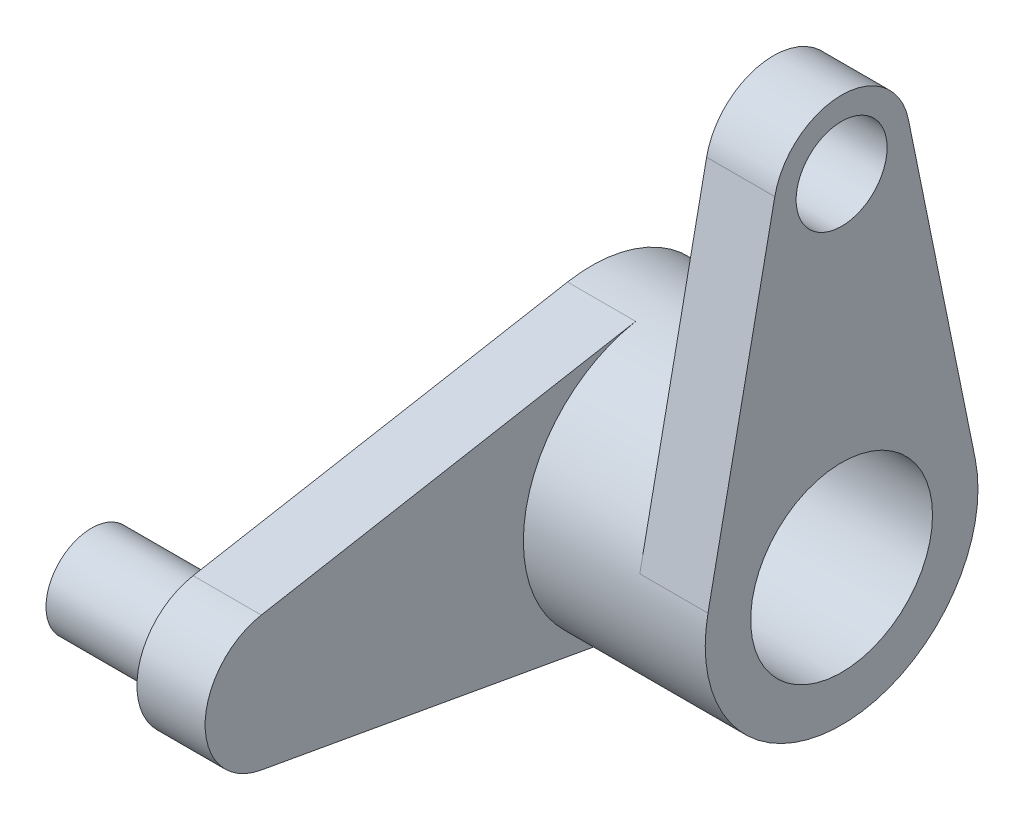
ISO-10303-21;
HEADER;
FILE_DESCRIPTION(('STEP AP214'),'2;1');
FILE_NAME('part.step','',(''),(''),'','','');
FILE_SCHEMA(('AUTOMOTIVE_DESIGN { 1 0 10303 214 1 1 1 1 }'));
ENDSEC;
DATA;
#1=APPLICATION_CONTEXT('core data for automotive mechanical design processes');
#2=APPLICATION_PROTOCOL_DEFINITION('international standard','automotive_design',2000,#1);
#3=PRODUCT_CONTEXT('',#1,'mechanical');
#4=PRODUCT('Part','Part','',(#3));
#5=PRODUCT_RELATED_PRODUCT_CATEGORY('part','',(#4));
#6=PRODUCT_DEFINITION_FORMATION('','',#4);
#7=PRODUCT_DEFINITION_CONTEXT('part definition',#1,'design');
#8=PRODUCT_DEFINITION('design','',#6,#7);
#9=PRODUCT_DEFINITION_SHAPE('','',#8);
#10=(LENGTH_UNIT() NAMED_UNIT(*) SI_UNIT(.MILLI.,.METRE.));
#11=(NAMED_UNIT(*) PLANE_ANGLE_UNIT() SI_UNIT($,.RADIAN.));
#12=(NAMED_UNIT(*) SI_UNIT($,.STERADIAN.) SOLID_ANGLE_UNIT());
#13=UNCERTAINTY_MEASURE_WITH_UNIT(LENGTH_MEASURE(1.E-05),#10,'distance_accuracy_value','');
#14=(GEOMETRIC_REPRESENTATION_CONTEXT(3) GLOBAL_UNCERTAINTY_ASSIGNED_CONTEXT((#13)) GLOBAL_UNIT_ASSIGNED_CONTEXT((#10,
#11,#12)) REPRESENTATION_CONTEXT('',''));
#15=CARTESIAN_POINT('',(0.,0.,0.));
#16=DIRECTION('',(0.,0.,1.));
#17=DIRECTION('',(1.,0.,0.));
#18=AXIS2_PLACEMENT_3D('',#15,#16,#17);
#19=CARTESIAN_POINT('',(15.,0.,85.));
#20=DIRECTION('',(-1.,0.,0.));
#21=DIRECTION('',(0.,0.,1.));
#22=AXIS2_PLACEMENT_3D('',#19,#20,#21);
#23=CYLINDRICAL_SURFACE('',#22,15.);
#24=CARTESIAN_POINT('',(0.,0.,85.));
#25=DIRECTION('',(1.,0.,0.));
#26=DIRECTION('',(0.,0.,-1.));
#27=AXIS2_PLACEMENT_3D('',#24,#25,#26);
#28=CIRCLE('',#27,15.);
#29=CARTESIAN_POINT('',(0.,14.7645887035425,87.6470588235293));
#30=VERTEX_POINT('',#29);
#31=CARTESIAN_POINT('',(0.,-14.7645887035425,87.6470588235294));
#32=VERTEX_POINT('',#31);
#33=EDGE_CURVE('E145',#30,#32,#28,.T.);
#34=ORIENTED_EDGE('',*,*,#33,.T.);
#35=DIRECTION('',(-1.,0.,0.));
#36=VECTOR('',#35,1.);
#37=CARTESIAN_POINT('',(15.,-14.7645887035425,87.6470588235294));
#38=LINE('',#37,#36);
#39=CARTESIAN_POINT('',(15.,-14.7645887035425,87.6470588235294));
#40=VERTEX_POINT('',#39);
#41=EDGE_CURVE('E46',#40,#32,#38,.T.);
#42=ORIENTED_EDGE('',*,*,#41,.F.);
#43=CARTESIAN_POINT('',(15.,0.,85.));
#44=DIRECTION('',(1.,0.,0.));
#45=DIRECTION('',(0.,0.,-1.));
#46=AXIS2_PLACEMENT_3D('',#43,#44,#45);
#47=CIRCLE('',#46,15.);
#48=CARTESIAN_POINT('',(15.,14.7645887035425,87.6470588235293));
#49=VERTEX_POINT('',#48);
#50=EDGE_CURVE('E147',#49,#40,#47,.T.);
#51=ORIENTED_EDGE('',*,*,#50,.F.);
#52=DIRECTION('',(-1.,0.,0.));
#53=VECTOR('',#52,1.);
#54=CARTESIAN_POINT('',(15.,14.7645887035425,87.6470588235293));
#55=LINE('',#54,#53);
#56=EDGE_CURVE('E151',#49,#30,#55,.T.);
#57=ORIENTED_EDGE('',*,*,#56,.T.);
#58=EDGE_LOOP('',(#34,#42,#51,#57));
#59=FACE_BOUND('',#58,.T.);
#60=ADVANCED_FACE('F39',(#59),#23,.T.);
#61=CARTESIAN_POINT('',(15.,-14.7645887035425,87.6470588235294));
#62=DIRECTION('',(0.,0.984305913569501,-0.176470588235294));
#63=DIRECTION('',(0.,0.176470588235294,0.984305913569501));
#64=AXIS2_PLACEMENT_3D('',#61,#62,#63);
#65=PLANE('',#64);
#66=DIRECTION('',(0.,-0.176470588235294,-0.984305913569501));
#67=VECTOR('',#66,1.);
#68=CARTESIAN_POINT('',(0.,-14.7645887035425,87.6470588235294));
#69=LINE('',#68,#67);
#70=CARTESIAN_POINT('',(0.,-29.529177407085,5.29411764705882));
#71=VERTEX_POINT('',#70);
#72=EDGE_CURVE('E154',#32,#71,#69,.T.);
#73=ORIENTED_EDGE('',*,*,#72,.T.);
#74=DIRECTION('',(-1.,0.,0.));
#75=VECTOR('',#74,1.);
#76=CARTESIAN_POINT('',(15.,-29.529177407085,5.29411764705882));
#77=LINE('',#76,#75);
#78=CARTESIAN_POINT('',(15.,-29.529177407085,5.29411764705882));
#79=VERTEX_POINT('',#78);
#80=EDGE_CURVE('E162',#79,#71,#77,.T.);
#81=ORIENTED_EDGE('',*,*,#80,.F.);
#82=DIRECTION('',(0.,-0.176470588235294,-0.984305913569501));
#83=VECTOR('',#82,1.);
#84=CARTESIAN_POINT('',(15.,-14.7645887035425,87.6470588235294));
#85=LINE('',#84,#83);
#86=EDGE_CURVE('E89',#40,#79,#85,.T.);
#87=ORIENTED_EDGE('',*,*,#86,.F.);
#88=ORIENTED_EDGE('',*,*,#41,.T.);
#89=EDGE_LOOP('',(#73,#81,#87,#88));
#90=FACE_BOUND('',#89,.T.);
#91=ADVANCED_FACE('F165',(#90),#65,.F.);
#92=CARTESIAN_POINT('',(15.,0.,0.));
#93=DIRECTION('',(-1.,0.,0.));
#94=DIRECTION('',(0.,0.,1.));
#95=AXIS2_PLACEMENT_3D('',#92,#93,#94);
#96=CYLINDRICAL_SURFACE('',#95,30.);
#97=CARTESIAN_POINT('',(0.,0.,0.));
#98=DIRECTION('',(1.,0.,0.));
#99=DIRECTION('',(0.,0.,-1.));
#100=AXIS2_PLACEMENT_3D('',#97,#98,#99);
#101=CIRCLE('',#100,30.);
#102=CARTESIAN_POINT('',(0.,29.529177407085,5.29411764705884));
#103=VERTEX_POINT('',#102);
#104=EDGE_CURVE('E156',#71,#103,#101,.T.);
#105=ORIENTED_EDGE('',*,*,#104,.T.);
#106=DIRECTION('',(-1.,0.,0.));
#107=VECTOR('',#106,1.);
#108=CARTESIAN_POINT('',(15.,29.529177407085,5.29411764705884));
#109=LINE('',#108,#107);
#110=CARTESIAN_POINT('',(15.,29.529177407085,5.29411764705884));
#111=VERTEX_POINT('',#110);
#112=EDGE_CURVE('E160',#111,#103,#109,.T.);
#113=ORIENTED_EDGE('',*,*,#112,.F.);
#114=CARTESIAN_POINT('',(15.,0.,0.));
#115=DIRECTION('',(1.,0.,0.));
#116=DIRECTION('',(0.,0.,-1.));
#117=AXIS2_PLACEMENT_3D('',#114,#115,#116);
#118=CIRCLE('',#117,30.);
#119=EDGE_CURVE('E137',#111,#79,#118,.T.);
#120=ORIENTED_EDGE('',*,*,#119,.T.);
#121=ORIENTED_EDGE('',*,*,#80,.T.);
#122=EDGE_LOOP('',(#105,#113,#120,#121));
#123=FACE_BOUND('',#122,.T.);
#124=CARTESIAN_POINT('',(40.,0.,0.));
#125=DIRECTION('',(1.,0.,0.));
#126=DIRECTION('',(0.,0.,-1.));
#127=AXIS2_PLACEMENT_3D('',#124,#125,#126);
#128=CIRCLE('',#127,30.);
#129=CARTESIAN_POINT('',(40.,5.99999999999999,-29.3938769133981));
#130=VERTEX_POINT('',#129);
#131=CARTESIAN_POINT('',(40.,5.99999999999999,29.3938769133981));
#132=VERTEX_POINT('',#131);
#133=EDGE_CURVE('E53',#130,#132,#128,.T.);
#134=ORIENTED_EDGE('',*,*,#133,.F.);
#135=DIRECTION('',(-1.,0.,0.));
#136=VECTOR('',#135,1.);
#137=CARTESIAN_POINT('',(55.,5.99999999999999,-29.3938769133981));
#138=LINE('',#137,#136);
#139=CARTESIAN_POINT('',(55.,5.99999999999999,-29.3938769133981));
#140=VERTEX_POINT('',#139);
#141=EDGE_CURVE('E118',#140,#130,#138,.T.);
#142=ORIENTED_EDGE('',*,*,#141,.F.);
#143=CARTESIAN_POINT('',(55.,0.,0.));
#144=DIRECTION('',(1.,0.,0.));
#145=DIRECTION('',(0.,0.,-1.));
#146=AXIS2_PLACEMENT_3D('',#143,#144,#145);
#147=CIRCLE('',#146,30.);
#148=CARTESIAN_POINT('',(55.,5.99999999999999,29.3938769133981));
#149=VERTEX_POINT('',#148);
#150=EDGE_CURVE('E124',#149,#140,#147,.T.);
#151=ORIENTED_EDGE('',*,*,#150,.F.);
#152=DIRECTION('',(-1.,0.,0.));
#153=VECTOR('',#152,1.);
#154=CARTESIAN_POINT('',(55.,5.99999999999999,29.3938769133981));
#155=LINE('',#154,#153);
#156=EDGE_CURVE('E339',#149,#132,#155,.T.);
#157=ORIENTED_EDGE('',*,*,#156,.T.);
#158=EDGE_LOOP('',(#134,#142,#151,#157));
#159=FACE_BOUND('',#158,.T.);
#160=ADVANCED_FACE('F136',(#123,#159),#96,.T.);
#161=CARTESIAN_POINT('',(15.,14.7645887035425,87.6470588235293));
#162=DIRECTION('',(0.,-0.9843059135695,-0.176470588235294));
#163=DIRECTION('',(0.,0.176470588235294,-0.984305913569501));
#164=AXIS2_PLACEMENT_3D('',#161,#162,#163);
#165=PLANE('',#164);
#166=DIRECTION('',(0.,-0.176470588235294,0.984305913569501));
#167=VECTOR('',#166,1.);
#168=CARTESIAN_POINT('',(0.,14.7645887035425,87.6470588235293));
#169=LINE('',#168,#167);
#170=EDGE_CURVE('E83',#103,#30,#169,.T.);
#171=ORIENTED_EDGE('',*,*,#170,.T.);
#172=ORIENTED_EDGE('',*,*,#56,.F.);
#173=DIRECTION('',(0.,-0.176470588235294,0.984305913569501));
#174=VECTOR('',#173,1.);
#175=CARTESIAN_POINT('',(15.,14.7645887035425,87.6470588235293));
#176=LINE('',#175,#174);
#177=EDGE_CURVE('E62',#111,#49,#176,.T.);
#178=ORIENTED_EDGE('',*,*,#177,.F.);
#179=ORIENTED_EDGE('',*,*,#112,.T.);
#180=EDGE_LOOP('',(#171,#172,#178,#179));
#181=FACE_BOUND('',#180,.T.);
#182=ADVANCED_FACE('F174',(#181),#165,.F.);
#183=CARTESIAN_POINT('',(15.,0.,85.));
#184=DIRECTION('',(1.,0.,0.));
#185=DIRECTION('',(0.,0.,-1.));
#186=AXIS2_PLACEMENT_3D('',#183,#184,#185);
#187=PLANE('',#186);
#188=ORIENTED_EDGE('',*,*,#119,.F.);
#189=ORIENTED_EDGE('',*,*,#177,.T.);
#190=ORIENTED_EDGE('',*,*,#50,.T.);
#191=ORIENTED_EDGE('',*,*,#86,.T.);
#192=EDGE_LOOP('',(#188,#189,#190,#191));
#193=FACE_BOUND('',#192,.T.);
#194=ADVANCED_FACE('F175',(#193),#187,.T.);
#195=CARTESIAN_POINT('',(0.,0.,85.));
#196=DIRECTION('',(1.,0.,0.));
#197=DIRECTION('',(0.,0.,-1.));
#198=AXIS2_PLACEMENT_3D('',#195,#196,#197);
#199=PLANE('',#198);
#200=CARTESIAN_POINT('',(0.,0.,85.));
#201=DIRECTION('',(1.,0.,0.));
#202=DIRECTION('',(0.,0.,-1.));
#203=AXIS2_PLACEMENT_3D('',#200,#201,#202);
#204=CIRCLE('',#203,10.);
#205=CARTESIAN_POINT('',(0.,0.,75.));
#206=VERTEX_POINT('',#205);
#207=EDGE_CURVE('E11',#206,#206,#204,.F.);
#208=ORIENTED_EDGE('',*,*,#207,.F.);
#209=EDGE_LOOP('',(#208));
#210=FACE_BOUND('',#209,.T.);
#211=CARTESIAN_POINT('',(0.,0.,0.));
#212=DIRECTION('',(1.,0.,0.));
#213=DIRECTION('',(0.,0.,-1.));
#214=AXIS2_PLACEMENT_3D('',#211,#212,#213);
#215=CIRCLE('',#214,20.);
#216=CARTESIAN_POINT('',(0.,0.,-20.));
#217=VERTEX_POINT('',#216);
#218=EDGE_CURVE('E322',#217,#217,#215,.T.);
#219=ORIENTED_EDGE('',*,*,#218,.T.);
#220=EDGE_LOOP('',(#219));
#221=FACE_BOUND('',#220,.T.);
#222=ORIENTED_EDGE('',*,*,#33,.F.);
#223=ORIENTED_EDGE('',*,*,#170,.F.);
#224=ORIENTED_EDGE('',*,*,#104,.F.);
#225=ORIENTED_EDGE('',*,*,#72,.F.);
#226=EDGE_LOOP('',(#222,#223,#224,#225));
#227=FACE_BOUND('',#226,.T.);
#228=ADVANCED_FACE('F170',(#210,#221,#227),#199,.F.);
#229=CARTESIAN_POINT('',(40.,0.,0.));
#230=DIRECTION('',(1.,0.,0.));
#231=DIRECTION('',(0.,0.,-1.));
#232=AXIS2_PLACEMENT_3D('',#229,#230,#231);
#233=PLANE('',#232);
#234=CARTESIAN_POINT('',(40.,75.,0.));
#235=DIRECTION('',(1.,0.,0.));
#236=DIRECTION('',(0.,0.,-1.));
#237=AXIS2_PLACEMENT_3D('',#234,#235,#236);
#238=CIRCLE('',#237,9.99999999999999);
#239=CARTESIAN_POINT('',(40.,75.,-9.99999999999999));
#240=VERTEX_POINT('',#239);
#241=EDGE_CURVE('E325',#240,#240,#238,.T.);
#242=ORIENTED_EDGE('',*,*,#241,.T.);
#243=EDGE_LOOP('',(#242));
#244=FACE_BOUND('',#243,.T.);
#245=DIRECTION('',(0.,0.979795897113271,0.2));
#246=VECTOR('',#245,1.);
#247=CARTESIAN_POINT('',(40.,5.99999999999999,-29.3938769133981));
#248=LINE('',#247,#246);
#249=CARTESIAN_POINT('',(40.,78.,-14.6969384566991));
#250=VERTEX_POINT('',#249);
#251=EDGE_CURVE('E335',#130,#250,#248,.T.);
#252=ORIENTED_EDGE('',*,*,#251,.F.);
#253=ORIENTED_EDGE('',*,*,#133,.T.);
#254=DIRECTION('',(0.,-0.979795897113271,0.2));
#255=VECTOR('',#254,1.);
#256=CARTESIAN_POINT('',(40.,5.99999999999999,29.3938769133981));
#257=LINE('',#256,#255);
#258=CARTESIAN_POINT('',(40.,78.,14.6969384566991));
#259=VERTEX_POINT('',#258);
#260=EDGE_CURVE('E134',#259,#132,#257,.T.);
#261=ORIENTED_EDGE('',*,*,#260,.F.);
#262=CARTESIAN_POINT('',(40.,75.,0.));
#263=DIRECTION('',(1.,0.,0.));
#264=DIRECTION('',(0.,0.,-1.));
#265=AXIS2_PLACEMENT_3D('',#262,#263,#264);
#266=CIRCLE('',#265,15.);
#267=EDGE_CURVE('E341',#250,#259,#266,.T.);
#268=ORIENTED_EDGE('',*,*,#267,.F.);
#269=EDGE_LOOP('',(#252,#253,#261,#268));
#270=FACE_BOUND('',#269,.T.);
#271=ADVANCED_FACE('F183',(#244,#270),#233,.F.);
#272=CARTESIAN_POINT('',(55.,0.,0.));
#273=DIRECTION('',(1.,0.,0.));
#274=DIRECTION('',(0.,0.,-1.));
#275=AXIS2_PLACEMENT_3D('',#272,#273,#274);
#276=PLANE('',#275);
#277=CARTESIAN_POINT('',(55.,0.,0.));
#278=DIRECTION('',(1.,0.,0.));
#279=DIRECTION('',(0.,0.,-1.));
#280=AXIS2_PLACEMENT_3D('',#277,#278,#279);
#281=CIRCLE('',#280,20.);
#282=CARTESIAN_POINT('',(55.,0.,-20.));
#283=VERTEX_POINT('',#282);
#284=EDGE_CURVE('E331',#283,#283,#281,.T.);
#285=ORIENTED_EDGE('',*,*,#284,.F.);
#286=EDGE_LOOP('',(#285));
#287=FACE_BOUND('',#286,.T.);
#288=ORIENTED_EDGE('',*,*,#150,.T.);
#289=DIRECTION('',(0.,0.979795897113271,0.2));
#290=VECTOR('',#289,1.);
#291=CARTESIAN_POINT('',(55.,5.99999999999999,-29.3938769133981));
#292=LINE('',#291,#290);
#293=CARTESIAN_POINT('',(55.,78.,-14.6969384566991));
#294=VERTEX_POINT('',#293);
#295=EDGE_CURVE('E114',#140,#294,#292,.T.);
#296=ORIENTED_EDGE('',*,*,#295,.T.);
#297=CARTESIAN_POINT('',(55.,75.,0.));
#298=DIRECTION('',(1.,0.,0.));
#299=DIRECTION('',(0.,0.,-1.));
#300=AXIS2_PLACEMENT_3D('',#297,#298,#299);
#301=CIRCLE('',#300,15.);
#302=CARTESIAN_POINT('',(55.,78.,14.6969384566991));
#303=VERTEX_POINT('',#302);
#304=EDGE_CURVE('E123',#294,#303,#301,.T.);
#305=ORIENTED_EDGE('',*,*,#304,.T.);
#306=DIRECTION('',(0.,-0.979795897113271,0.2));
#307=VECTOR('',#306,1.);
#308=CARTESIAN_POINT('',(55.,5.99999999999999,29.3938769133981));
#309=LINE('',#308,#307);
#310=EDGE_CURVE('E130',#303,#149,#309,.T.);
#311=ORIENTED_EDGE('',*,*,#310,.T.);
#312=EDGE_LOOP('',(#288,#296,#305,#311));
#313=FACE_BOUND('',#312,.T.);
#314=CARTESIAN_POINT('',(55.,75.,0.));
#315=DIRECTION('',(1.,0.,0.));
#316=DIRECTION('',(0.,0.,-1.));
#317=AXIS2_PLACEMENT_3D('',#314,#315,#316);
#318=CIRCLE('',#317,9.99999999999999);
#319=CARTESIAN_POINT('',(55.,75.,-9.99999999999999));
#320=VERTEX_POINT('',#319);
#321=EDGE_CURVE('E328',#320,#320,#318,.T.);
#322=ORIENTED_EDGE('',*,*,#321,.F.);
#323=EDGE_LOOP('',(#322));
#324=FACE_BOUND('',#323,.T.);
#325=ADVANCED_FACE('F127',(#287,#313,#324),#276,.T.);
#326=CARTESIAN_POINT('',(55.,5.99999999999999,-29.3938769133981));
#327=DIRECTION('',(0.,-0.2,0.979795897113271));
#328=DIRECTION('',(0.,-0.979795897113271,-0.2));
#329=AXIS2_PLACEMENT_3D('',#326,#327,#328);
#330=PLANE('',#329);
#331=ORIENTED_EDGE('',*,*,#251,.T.);
#332=DIRECTION('',(-1.,0.,0.));
#333=VECTOR('',#332,1.);
#334=CARTESIAN_POINT('',(55.,78.,-14.6969384566991));
#335=LINE('',#334,#333);
#336=EDGE_CURVE('E120',#294,#250,#335,.T.);
#337=ORIENTED_EDGE('',*,*,#336,.F.);
#338=ORIENTED_EDGE('',*,*,#295,.F.);
#339=ORIENTED_EDGE('',*,*,#141,.T.);
#340=EDGE_LOOP('',(#331,#337,#338,#339));
#341=FACE_BOUND('',#340,.T.);
#342=ADVANCED_FACE('F116',(#341),#330,.F.);
#343=CARTESIAN_POINT('',(55.,75.,0.));
#344=DIRECTION('',(-1.,0.,0.));
#345=DIRECTION('',(0.,0.,1.));
#346=AXIS2_PLACEMENT_3D('',#343,#344,#345);
#347=CYLINDRICAL_SURFACE('',#346,15.);
#348=ORIENTED_EDGE('',*,*,#267,.T.);
#349=DIRECTION('',(-1.,0.,0.));
#350=VECTOR('',#349,1.);
#351=CARTESIAN_POINT('',(55.,78.,14.6969384566991));
#352=LINE('',#351,#350);
#353=EDGE_CURVE('E141',#303,#259,#352,.T.);
#354=ORIENTED_EDGE('',*,*,#353,.F.);
#355=ORIENTED_EDGE('',*,*,#304,.F.);
#356=ORIENTED_EDGE('',*,*,#336,.T.);
#357=EDGE_LOOP('',(#348,#354,#355,#356));
#358=FACE_BOUND('',#357,.T.);
#359=ADVANCED_FACE('F220',(#358),#347,.T.);
#360=CARTESIAN_POINT('',(55.,5.99999999999999,29.3938769133981));
#361=DIRECTION('',(0.,-0.2,-0.979795897113271));
#362=DIRECTION('',(0.,0.979795897113271,-0.2));
#363=AXIS2_PLACEMENT_3D('',#360,#361,#362);
#364=PLANE('',#363);
#365=ORIENTED_EDGE('',*,*,#260,.T.);
#366=ORIENTED_EDGE('',*,*,#156,.F.);
#367=ORIENTED_EDGE('',*,*,#310,.F.);
#368=ORIENTED_EDGE('',*,*,#353,.T.);
#369=EDGE_LOOP('',(#365,#366,#367,#368));
#370=FACE_BOUND('',#369,.T.);
#371=ADVANCED_FACE('F227',(#370),#364,.F.);
#372=CARTESIAN_POINT('',(55.,0.,0.));
#373=DIRECTION('',(-1.,0.,0.));
#374=DIRECTION('',(0.,0.,1.));
#375=AXIS2_PLACEMENT_3D('',#372,#373,#374);
#376=CYLINDRICAL_SURFACE('',#375,20.);
#377=ORIENTED_EDGE('',*,*,#284,.T.);
#378=EDGE_LOOP('',(#377));
#379=FACE_BOUND('',#378,.T.);
#380=ORIENTED_EDGE('',*,*,#218,.F.);
#381=EDGE_LOOP('',(#380));
#382=FACE_BOUND('',#381,.T.);
#383=ADVANCED_FACE('F236',(#379,#382),#376,.F.);
#384=CARTESIAN_POINT('',(55.,75.,0.));
#385=DIRECTION('',(-1.,0.,0.));
#386=DIRECTION('',(0.,0.,1.));
#387=AXIS2_PLACEMENT_3D('',#384,#385,#386);
#388=CYLINDRICAL_SURFACE('',#387,9.99999999999999);
#389=ORIENTED_EDGE('',*,*,#321,.T.);
#390=EDGE_LOOP('',(#389));
#391=FACE_BOUND('',#390,.T.);
#392=ORIENTED_EDGE('',*,*,#241,.F.);
#393=EDGE_LOOP('',(#392));
#394=FACE_BOUND('',#393,.T.);
#395=ADVANCED_FACE('F243',(#391,#394),#388,.F.);
#396=CARTESIAN_POINT('',(-25.,0.,85.));
#397=DIRECTION('',(1.,0.,0.));
#398=DIRECTION('',(0.,0.,-1.));
#399=AXIS2_PLACEMENT_3D('',#396,#397,#398);
#400=CYLINDRICAL_SURFACE('',#399,10.);
#401=CARTESIAN_POINT('',(-25.,0.,85.));
#402=DIRECTION('',(-1.,0.,0.));
#403=DIRECTION('',(0.,0.,1.));
#404=AXIS2_PLACEMENT_3D('',#401,#402,#403);
#405=CIRCLE('',#404,10.);
#406=CARTESIAN_POINT('',(-25.,0.,95.));
#407=VERTEX_POINT('',#406);
#408=EDGE_CURVE('E321',#407,#407,#405,.T.);
#409=ORIENTED_EDGE('',*,*,#408,.F.);
#410=EDGE_LOOP('',(#409));
#411=FACE_BOUND('',#410,.T.);
#412=ORIENTED_EDGE('',*,*,#207,.T.);
#413=EDGE_LOOP('',(#412));
#414=FACE_BOUND('',#413,.T.);
#415=ADVANCED_FACE('F247',(#411,#414),#400,.T.);
#416=CARTESIAN_POINT('',(-25.,0.,85.));
#417=DIRECTION('',(-1.,0.,0.));
#418=DIRECTION('',(0.,0.,1.));
#419=AXIS2_PLACEMENT_3D('',#416,#417,#418);
#420=PLANE('',#419);
#421=ORIENTED_EDGE('',*,*,#408,.T.);
#422=EDGE_LOOP('',(#421));
#423=FACE_BOUND('',#422,.T.);
#424=ADVANCED_FACE('F268',(#423),#420,.T.);
#425=CLOSED_SHELL('',(#60,#91,#160,#182,#194,#228,#271,#325,#342,#359,#371,#383,#395,#415,#424));
#426=MANIFOLD_SOLID_BREP('B2',#425);
#427=ADVANCED_BREP_SHAPE_REPRESENTATION('',(#18,#426),#14);
#428=SHAPE_DEFINITION_REPRESENTATION(#9,#427);
ENDSEC;
END-ISO-10303-21;
